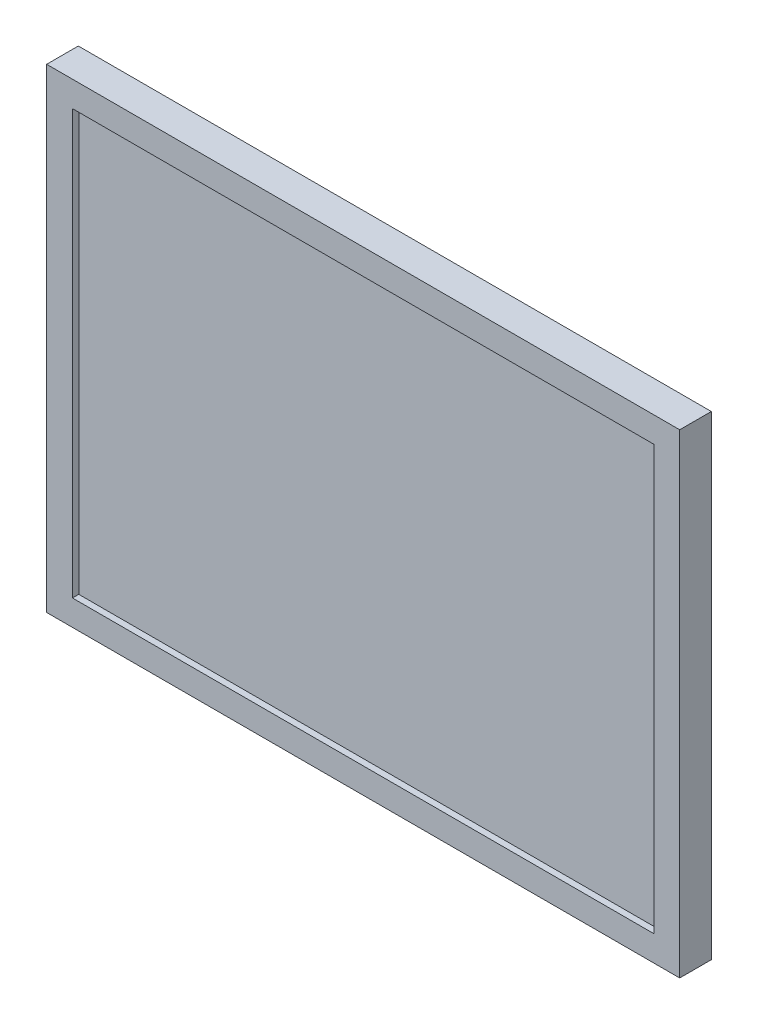
ISO-10303-21;
HEADER;
FILE_DESCRIPTION(('STEP AP214'),'2;1');
FILE_NAME('part.step','',(''),(''),'','','');
FILE_SCHEMA(('AUTOMOTIVE_DESIGN { 1 0 10303 214 1 1 1 1 }'));
ENDSEC;
DATA;
#1=APPLICATION_CONTEXT('core data for automotive mechanical design processes');
#2=APPLICATION_PROTOCOL_DEFINITION('international standard','automotive_design',2000,#1);
#3=PRODUCT_CONTEXT('',#1,'mechanical');
#4=PRODUCT('Part','Part','',(#3));
#5=PRODUCT_RELATED_PRODUCT_CATEGORY('part','',(#4));
#6=PRODUCT_DEFINITION_FORMATION('','',#4);
#7=PRODUCT_DEFINITION_CONTEXT('part definition',#1,'design');
#8=PRODUCT_DEFINITION('design','',#6,#7);
#9=PRODUCT_DEFINITION_SHAPE('','',#8);
#10=(LENGTH_UNIT() NAMED_UNIT(*) SI_UNIT(.MILLI.,.METRE.));
#11=(NAMED_UNIT(*) PLANE_ANGLE_UNIT() SI_UNIT($,.RADIAN.));
#12=(NAMED_UNIT(*) SI_UNIT($,.STERADIAN.) SOLID_ANGLE_UNIT());
#13=UNCERTAINTY_MEASURE_WITH_UNIT(LENGTH_MEASURE(1.E-05),#10,'distance_accuracy_value','');
#14=(GEOMETRIC_REPRESENTATION_CONTEXT(3) GLOBAL_UNCERTAINTY_ASSIGNED_CONTEXT((#13)) GLOBAL_UNIT_ASSIGNED_CONTEXT((#10,
#11,#12)) REPRESENTATION_CONTEXT('',''));
#15=CARTESIAN_POINT('',(0.,0.,0.));
#16=DIRECTION('',(0.,0.,1.));
#17=DIRECTION('',(1.,0.,0.));
#18=AXIS2_PLACEMENT_3D('',#15,#16,#17);
#19=CARTESIAN_POINT('',(-100.,-75.,10.));
#20=DIRECTION('',(1.,0.,0.));
#21=DIRECTION('',(0.,0.,-1.));
#22=AXIS2_PLACEMENT_3D('',#19,#20,#21);
#23=PLANE('',#22);
#24=DIRECTION('',(0.,-1.,0.));
#25=VECTOR('',#24,1.);
#26=CARTESIAN_POINT('',(-100.,-75.,0.));
#27=LINE('',#26,#25);
#28=CARTESIAN_POINT('',(-100.,75.,0.));
#29=VERTEX_POINT('',#28);
#30=CARTESIAN_POINT('',(-100.,-75.,0.));
#31=VERTEX_POINT('',#30);
#32=EDGE_CURVE('E160',#29,#31,#27,.T.);
#33=ORIENTED_EDGE('',*,*,#32,.T.);
#34=DIRECTION('',(0.,0.,-1.));
#35=VECTOR('',#34,1.);
#36=CARTESIAN_POINT('',(-100.,-75.,10.));
#37=LINE('',#36,#35);
#38=CARTESIAN_POINT('',(-100.,-75.,10.));
#39=VERTEX_POINT('',#38);
#40=EDGE_CURVE('E11',#39,#31,#37,.T.);
#41=ORIENTED_EDGE('',*,*,#40,.F.);
#42=DIRECTION('',(0.,-1.,0.));
#43=VECTOR('',#42,1.);
#44=CARTESIAN_POINT('',(-100.,-75.,10.));
#45=LINE('',#44,#43);
#46=CARTESIAN_POINT('',(-100.,75.,10.));
#47=VERTEX_POINT('',#46);
#48=EDGE_CURVE('E166',#47,#39,#45,.T.);
#49=ORIENTED_EDGE('',*,*,#48,.F.);
#50=DIRECTION('',(0.,0.,-1.));
#51=VECTOR('',#50,1.);
#52=CARTESIAN_POINT('',(-100.,75.,10.));
#53=LINE('',#52,#51);
#54=EDGE_CURVE('E176',#47,#29,#53,.T.);
#55=ORIENTED_EDGE('',*,*,#54,.T.);
#56=EDGE_LOOP('',(#33,#41,#49,#55));
#57=FACE_BOUND('',#56,.T.);
#58=ADVANCED_FACE('F41',(#57),#23,.F.);
#59=CARTESIAN_POINT('',(100.,-75.,10.));
#60=DIRECTION('',(0.,1.,0.));
#61=DIRECTION('',(-1.,0.,0.));
#62=AXIS2_PLACEMENT_3D('',#59,#60,#61);
#63=PLANE('',#62);
#64=DIRECTION('',(1.,0.,0.));
#65=VECTOR('',#64,1.);
#66=CARTESIAN_POINT('',(100.,-75.,0.));
#67=LINE('',#66,#65);
#68=CARTESIAN_POINT('',(100.,-75.,0.));
#69=VERTEX_POINT('',#68);
#70=EDGE_CURVE('E180',#31,#69,#67,.T.);
#71=ORIENTED_EDGE('',*,*,#70,.T.);
#72=DIRECTION('',(0.,0.,-1.));
#73=VECTOR('',#72,1.);
#74=CARTESIAN_POINT('',(100.,-75.,10.));
#75=LINE('',#74,#73);
#76=CARTESIAN_POINT('',(100.,-75.,10.));
#77=VERTEX_POINT('',#76);
#78=EDGE_CURVE('E49',#77,#69,#75,.T.);
#79=ORIENTED_EDGE('',*,*,#78,.F.);
#80=DIRECTION('',(1.,0.,0.));
#81=VECTOR('',#80,1.);
#82=CARTESIAN_POINT('',(100.,-75.,10.));
#83=LINE('',#82,#81);
#84=EDGE_CURVE('E93',#39,#77,#83,.T.);
#85=ORIENTED_EDGE('',*,*,#84,.F.);
#86=ORIENTED_EDGE('',*,*,#40,.T.);
#87=EDGE_LOOP('',(#71,#79,#85,#86));
#88=FACE_BOUND('',#87,.T.);
#89=ADVANCED_FACE('F215',(#88),#63,.F.);
#90=CARTESIAN_POINT('',(100.,-75.,10.));
#91=DIRECTION('',(-1.,0.,0.));
#92=DIRECTION('',(0.,0.,1.));
#93=AXIS2_PLACEMENT_3D('',#90,#91,#92);
#94=PLANE('',#93);
#95=DIRECTION('',(0.,1.,0.));
#96=VECTOR('',#95,1.);
#97=CARTESIAN_POINT('',(100.,-75.,0.));
#98=LINE('',#97,#96);
#99=CARTESIAN_POINT('',(100.,75.,0.));
#100=VERTEX_POINT('',#99);
#101=EDGE_CURVE('E183',#69,#100,#98,.T.);
#102=ORIENTED_EDGE('',*,*,#101,.T.);
#103=DIRECTION('',(0.,0.,-1.));
#104=VECTOR('',#103,1.);
#105=CARTESIAN_POINT('',(100.,75.,10.));
#106=LINE('',#105,#104);
#107=CARTESIAN_POINT('',(100.,75.,10.));
#108=VERTEX_POINT('',#107);
#109=EDGE_CURVE('E190',#108,#100,#106,.T.);
#110=ORIENTED_EDGE('',*,*,#109,.F.);
#111=DIRECTION('',(0.,1.,0.));
#112=VECTOR('',#111,1.);
#113=CARTESIAN_POINT('',(100.,-75.,10.));
#114=LINE('',#113,#112);
#115=EDGE_CURVE('E171',#77,#108,#114,.T.);
#116=ORIENTED_EDGE('',*,*,#115,.F.);
#117=ORIENTED_EDGE('',*,*,#78,.T.);
#118=EDGE_LOOP('',(#102,#110,#116,#117));
#119=FACE_BOUND('',#118,.T.);
#120=ADVANCED_FACE('F197',(#119),#94,.F.);
#121=CARTESIAN_POINT('',(100.,75.,10.));
#122=DIRECTION('',(0.,-1.,0.));
#123=DIRECTION('',(1.,0.,0.));
#124=AXIS2_PLACEMENT_3D('',#121,#122,#123);
#125=PLANE('',#124);
#126=DIRECTION('',(-1.,0.,0.));
#127=VECTOR('',#126,1.);
#128=CARTESIAN_POINT('',(100.,75.,0.));
#129=LINE('',#128,#127);
#130=EDGE_CURVE('E86',#100,#29,#129,.T.);
#131=ORIENTED_EDGE('',*,*,#130,.T.);
#132=ORIENTED_EDGE('',*,*,#54,.F.);
#133=DIRECTION('',(-1.,0.,0.));
#134=VECTOR('',#133,1.);
#135=CARTESIAN_POINT('',(100.,75.,10.));
#136=LINE('',#135,#134);
#137=EDGE_CURVE('E65',#108,#47,#136,.T.);
#138=ORIENTED_EDGE('',*,*,#137,.F.);
#139=ORIENTED_EDGE('',*,*,#109,.T.);
#140=EDGE_LOOP('',(#131,#132,#138,#139));
#141=FACE_BOUND('',#140,.T.);
#142=ADVANCED_FACE('F205',(#141),#125,.F.);
#143=CARTESIAN_POINT('',(0.,0.,10.));
#144=DIRECTION('',(0.,0.,1.));
#145=DIRECTION('',(1.,0.,0.));
#146=AXIS2_PLACEMENT_3D('',#143,#144,#145);
#147=PLANE('',#146);
#148=DIRECTION('',(0.,-1.,0.));
#149=VECTOR('',#148,1.);
#150=CARTESIAN_POINT('',(-91.8513517375401,-66.9528034979425,10.));
#151=LINE('',#150,#149);
#152=CARTESIAN_POINT('',(-91.8513517375401,66.9528034979425,10.));
#153=VERTEX_POINT('',#152);
#154=CARTESIAN_POINT('',(-91.8513517375401,-66.9528034979425,10.));
#155=VERTEX_POINT('',#154);
#156=EDGE_CURVE('E56',#153,#155,#151,.T.);
#157=ORIENTED_EDGE('',*,*,#156,.F.);
#158=DIRECTION('',(-1.,0.,0.));
#159=VECTOR('',#158,1.);
#160=CARTESIAN_POINT('',(91.8513517375401,66.9528034979425,10.));
#161=LINE('',#160,#159);
#162=CARTESIAN_POINT('',(91.8513517375401,66.9528034979425,10.));
#163=VERTEX_POINT('',#162);
#164=EDGE_CURVE('E138',#163,#153,#161,.T.);
#165=ORIENTED_EDGE('',*,*,#164,.F.);
#166=DIRECTION('',(0.,1.,0.));
#167=VECTOR('',#166,1.);
#168=CARTESIAN_POINT('',(91.8513517375401,-66.9528034979425,10.));
#169=LINE('',#168,#167);
#170=CARTESIAN_POINT('',(91.8513517375401,-66.9528034979425,10.));
#171=VERTEX_POINT('',#170);
#172=EDGE_CURVE('E142',#171,#163,#169,.T.);
#173=ORIENTED_EDGE('',*,*,#172,.F.);
#174=DIRECTION('',(1.,0.,0.));
#175=VECTOR('',#174,1.);
#176=CARTESIAN_POINT('',(91.8513517375401,-66.9528034979425,10.));
#177=LINE('',#176,#175);
#178=EDGE_CURVE('E151',#155,#171,#177,.T.);
#179=ORIENTED_EDGE('',*,*,#178,.F.);
#180=EDGE_LOOP('',(#157,#165,#173,#179));
#181=FACE_BOUND('',#180,.T.);
#182=ORIENTED_EDGE('',*,*,#48,.T.);
#183=ORIENTED_EDGE('',*,*,#84,.T.);
#184=ORIENTED_EDGE('',*,*,#115,.T.);
#185=ORIENTED_EDGE('',*,*,#137,.T.);
#186=EDGE_LOOP('',(#182,#183,#184,#185));
#187=FACE_BOUND('',#186,.T.);
#188=ADVANCED_FACE('F207',(#181,#187),#147,.T.);
#189=CARTESIAN_POINT('',(0.,0.,0.));
#190=DIRECTION('',(0.,0.,1.));
#191=DIRECTION('',(1.,0.,0.));
#192=AXIS2_PLACEMENT_3D('',#189,#190,#191);
#193=PLANE('',#192);
#194=ORIENTED_EDGE('',*,*,#32,.F.);
#195=ORIENTED_EDGE('',*,*,#130,.F.);
#196=ORIENTED_EDGE('',*,*,#101,.F.);
#197=ORIENTED_EDGE('',*,*,#70,.F.);
#198=EDGE_LOOP('',(#194,#195,#196,#197));
#199=FACE_BOUND('',#198,.T.);
#200=ADVANCED_FACE('F201',(#199),#193,.F.);
#201=CARTESIAN_POINT('',(-91.8513517375401,-66.9528034979425,8.));
#202=DIRECTION('',(-1.,0.,0.));
#203=DIRECTION('',(0.,0.,1.));
#204=AXIS2_PLACEMENT_3D('',#201,#202,#203);
#205=PLANE('',#204);
#206=ORIENTED_EDGE('',*,*,#156,.T.);
#207=DIRECTION('',(0.,0.,1.));
#208=VECTOR('',#207,1.);
#209=CARTESIAN_POINT('',(-91.8513517375401,-66.9528034979425,8.));
#210=LINE('',#209,#208);
#211=CARTESIAN_POINT('',(-91.8513517375401,-66.9528034979425,8.));
#212=VERTEX_POINT('',#211);
#213=EDGE_CURVE('E113',#212,#155,#210,.T.);
#214=ORIENTED_EDGE('',*,*,#213,.F.);
#215=DIRECTION('',(0.,-1.,0.));
#216=VECTOR('',#215,1.);
#217=CARTESIAN_POINT('',(-91.8513517375401,-66.9528034979425,8.));
#218=LINE('',#217,#216);
#219=CARTESIAN_POINT('',(-91.8513517375401,66.9528034979425,8.));
#220=VERTEX_POINT('',#219);
#221=EDGE_CURVE('E117',#220,#212,#218,.T.);
#222=ORIENTED_EDGE('',*,*,#221,.F.);
#223=DIRECTION('',(0.,0.,1.));
#224=VECTOR('',#223,1.);
#225=CARTESIAN_POINT('',(-91.8513517375401,66.9528034979425,8.));
#226=LINE('',#225,#224);
#227=EDGE_CURVE('E157',#220,#153,#226,.T.);
#228=ORIENTED_EDGE('',*,*,#227,.T.);
#229=EDGE_LOOP('',(#206,#214,#222,#228));
#230=FACE_BOUND('',#229,.T.);
#231=ADVANCED_FACE('F115',(#230),#205,.F.);
#232=CARTESIAN_POINT('',(91.8513517375401,66.9528034979425,8.));
#233=DIRECTION('',(0.,1.,0.));
#234=DIRECTION('',(0.,0.,1.));
#235=AXIS2_PLACEMENT_3D('',#232,#233,#234);
#236=PLANE('',#235);
#237=ORIENTED_EDGE('',*,*,#164,.T.);
#238=ORIENTED_EDGE('',*,*,#227,.F.);
#239=DIRECTION('',(-1.,0.,0.));
#240=VECTOR('',#239,1.);
#241=CARTESIAN_POINT('',(91.8513517375401,66.9528034979425,8.));
#242=LINE('',#241,#240);
#243=CARTESIAN_POINT('',(91.8513517375401,66.9528034979425,8.));
#244=VERTEX_POINT('',#243);
#245=EDGE_CURVE('E124',#244,#220,#242,.T.);
#246=ORIENTED_EDGE('',*,*,#245,.F.);
#247=DIRECTION('',(0.,0.,1.));
#248=VECTOR('',#247,1.);
#249=CARTESIAN_POINT('',(91.8513517375401,66.9528034979425,8.));
#250=LINE('',#249,#248);
#251=EDGE_CURVE('E161',#244,#163,#250,.T.);
#252=ORIENTED_EDGE('',*,*,#251,.T.);
#253=EDGE_LOOP('',(#237,#238,#246,#252));
#254=FACE_BOUND('',#253,.T.);
#255=ADVANCED_FACE('F254',(#254),#236,.F.);
#256=CARTESIAN_POINT('',(91.8513517375401,-66.9528034979425,8.));
#257=DIRECTION('',(1.,0.,0.));
#258=DIRECTION('',(0.,0.,-1.));
#259=AXIS2_PLACEMENT_3D('',#256,#257,#258);
#260=PLANE('',#259);
#261=ORIENTED_EDGE('',*,*,#172,.T.);
#262=ORIENTED_EDGE('',*,*,#251,.F.);
#263=DIRECTION('',(0.,1.,0.));
#264=VECTOR('',#263,1.);
#265=CARTESIAN_POINT('',(91.8513517375401,-66.9528034979425,8.));
#266=LINE('',#265,#264);
#267=CARTESIAN_POINT('',(91.8513517375401,-66.9528034979425,8.));
#268=VERTEX_POINT('',#267);
#269=EDGE_CURVE('E133',#268,#244,#266,.T.);
#270=ORIENTED_EDGE('',*,*,#269,.F.);
#271=DIRECTION('',(0.,0.,1.));
#272=VECTOR('',#271,1.);
#273=CARTESIAN_POINT('',(91.8513517375401,-66.9528034979425,8.));
#274=LINE('',#273,#272);
#275=EDGE_CURVE('E123',#268,#171,#274,.T.);
#276=ORIENTED_EDGE('',*,*,#275,.T.);
#277=EDGE_LOOP('',(#261,#262,#270,#276));
#278=FACE_BOUND('',#277,.T.);
#279=ADVANCED_FACE('F263',(#278),#260,.F.);
#280=CARTESIAN_POINT('',(91.8513517375401,-66.9528034979425,8.));
#281=DIRECTION('',(0.,-1.,0.));
#282=DIRECTION('',(0.,0.,-1.));
#283=AXIS2_PLACEMENT_3D('',#280,#281,#282);
#284=PLANE('',#283);
#285=ORIENTED_EDGE('',*,*,#178,.T.);
#286=ORIENTED_EDGE('',*,*,#275,.F.);
#287=DIRECTION('',(1.,0.,0.));
#288=VECTOR('',#287,1.);
#289=CARTESIAN_POINT('',(91.8513517375401,-66.9528034979425,8.));
#290=LINE('',#289,#288);
#291=EDGE_CURVE('E127',#212,#268,#290,.T.);
#292=ORIENTED_EDGE('',*,*,#291,.F.);
#293=ORIENTED_EDGE('',*,*,#213,.T.);
#294=EDGE_LOOP('',(#285,#286,#292,#293));
#295=FACE_BOUND('',#294,.T.);
#296=ADVANCED_FACE('F128',(#295),#284,.F.);
#297=CARTESIAN_POINT('',(0.,0.,8.));
#298=DIRECTION('',(0.,0.,1.));
#299=DIRECTION('',(1.,0.,0.));
#300=AXIS2_PLACEMENT_3D('',#297,#298,#299);
#301=PLANE('',#300);
#302=ORIENTED_EDGE('',*,*,#221,.T.);
#303=ORIENTED_EDGE('',*,*,#291,.T.);
#304=ORIENTED_EDGE('',*,*,#269,.T.);
#305=ORIENTED_EDGE('',*,*,#245,.T.);
#306=EDGE_LOOP('',(#302,#303,#304,#305));
#307=FACE_BOUND('',#306,.T.);
#308=ADVANCED_FACE('F135',(#307),#301,.T.);
#309=CLOSED_SHELL('',(#58,#89,#120,#142,#188,#200,#231,#255,#279,#296,#308));
#310=MANIFOLD_SOLID_BREP('B2',#309);
#311=ADVANCED_BREP_SHAPE_REPRESENTATION('',(#18,#310),#14);
#312=SHAPE_DEFINITION_REPRESENTATION(#9,#311);
ENDSEC;
END-ISO-10303-21;
